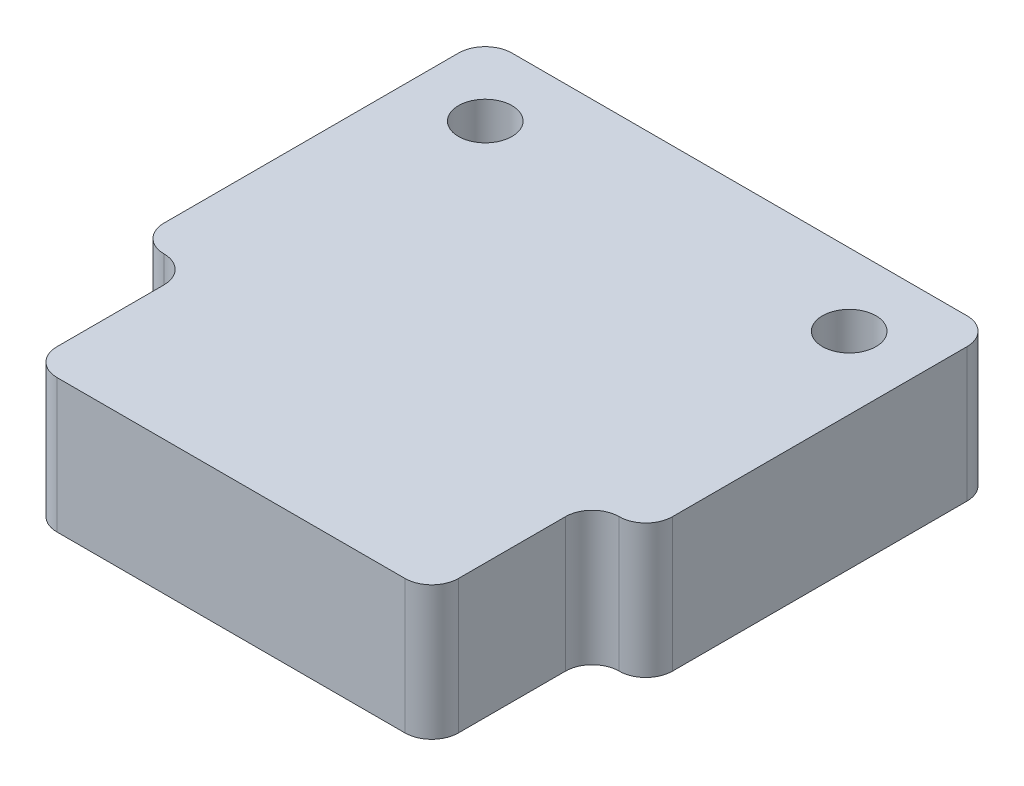
ISO-10303-21;
HEADER;
FILE_DESCRIPTION(('STEP AP214'),'2;1');
FILE_NAME('part.step','',(''),(''),'','','');
FILE_SCHEMA(('AUTOMOTIVE_DESIGN { 1 0 10303 214 1 1 1 1 }'));
ENDSEC;
DATA;
#1=APPLICATION_CONTEXT('core data for automotive mechanical design processes');
#2=APPLICATION_PROTOCOL_DEFINITION('international standard','automotive_design',2000,#1);
#3=PRODUCT_CONTEXT('',#1,'mechanical');
#4=PRODUCT('Part','Part','',(#3));
#5=PRODUCT_RELATED_PRODUCT_CATEGORY('part','',(#4));
#6=PRODUCT_DEFINITION_FORMATION('','',#4);
#7=PRODUCT_DEFINITION_CONTEXT('part definition',#1,'design');
#8=PRODUCT_DEFINITION('design','',#6,#7);
#9=PRODUCT_DEFINITION_SHAPE('','',#8);
#10=(LENGTH_UNIT() NAMED_UNIT(*) SI_UNIT(.MILLI.,.METRE.));
#11=(NAMED_UNIT(*) PLANE_ANGLE_UNIT() SI_UNIT($,.RADIAN.));
#12=(NAMED_UNIT(*) SI_UNIT($,.STERADIAN.) SOLID_ANGLE_UNIT());
#13=UNCERTAINTY_MEASURE_WITH_UNIT(LENGTH_MEASURE(1.E-05),#10,'distance_accuracy_value','');
#14=(GEOMETRIC_REPRESENTATION_CONTEXT(3) GLOBAL_UNCERTAINTY_ASSIGNED_CONTEXT((#13)) GLOBAL_UNIT_ASSIGNED_CONTEXT((#10,
#11,#12)) REPRESENTATION_CONTEXT('',''));
#15=CARTESIAN_POINT('',(0.,0.,0.));
#16=DIRECTION('',(0.,0.,1.));
#17=DIRECTION('',(1.,0.,0.));
#18=AXIS2_PLACEMENT_3D('',#15,#16,#17);
#19=CARTESIAN_POINT('',(0.,5.,0.));
#20=DIRECTION('',(0.,-1.,0.));
#21=DIRECTION('',(0.,0.,-1.));
#22=AXIS2_PLACEMENT_3D('',#19,#20,#21);
#23=PLANE('',#22);
#24=DIRECTION('',(0.,0.,-1.));
#25=VECTOR('',#24,1.);
#26=CARTESIAN_POINT('',(9.49999999999999,5.,3.5));
#27=LINE('',#26,#25);
#28=CARTESIAN_POINT('',(9.49999999999999,5.,2.49999999999999));
#29=VERTEX_POINT('',#28);
#30=CARTESIAN_POINT('',(9.49999999999999,5.,-8.50000000000001));
#31=VERTEX_POINT('',#30);
#32=EDGE_CURVE('E252',#29,#31,#27,.T.);
#33=ORIENTED_EDGE('',*,*,#32,.T.);
#34=CARTESIAN_POINT('',(8.49999999999999,5.,-8.50000000000001));
#35=DIRECTION('',(0.,-1.,0.));
#36=DIRECTION('',(0.,0.,-1.));
#37=AXIS2_PLACEMENT_3D('',#34,#35,#36);
#38=CIRCLE('',#37,1.);
#39=CARTESIAN_POINT('',(8.49999999999999,5.,-9.50000000000001));
#40=VERTEX_POINT('',#39);
#41=EDGE_CURVE('E202',#31,#40,#38,.F.);
#42=ORIENTED_EDGE('',*,*,#41,.T.);
#43=DIRECTION('',(-1.,0.,0.));
#44=VECTOR('',#43,1.);
#45=CARTESIAN_POINT('',(-9.5,5.,-9.5));
#46=LINE('',#45,#44);
#47=CARTESIAN_POINT('',(-8.5,5.,-9.5));
#48=VERTEX_POINT('',#47);
#49=EDGE_CURVE('E164',#40,#48,#46,.T.);
#50=ORIENTED_EDGE('',*,*,#49,.T.);
#51=CARTESIAN_POINT('',(-8.5,5.,-8.5));
#52=DIRECTION('',(0.,-1.,0.));
#53=DIRECTION('',(0.,0.,-1.));
#54=AXIS2_PLACEMENT_3D('',#51,#52,#53);
#55=CIRCLE('',#54,1.);
#56=CARTESIAN_POINT('',(-9.5,5.,-8.5));
#57=VERTEX_POINT('',#56);
#58=EDGE_CURVE('E65',#48,#57,#55,.F.);
#59=ORIENTED_EDGE('',*,*,#58,.T.);
#60=DIRECTION('',(0.,0.,1.));
#61=VECTOR('',#60,1.);
#62=CARTESIAN_POINT('',(-9.5,5.,3.5));
#63=LINE('',#62,#61);
#64=CARTESIAN_POINT('',(-9.5,5.,2.5));
#65=VERTEX_POINT('',#64);
#66=EDGE_CURVE('E180',#57,#65,#63,.T.);
#67=ORIENTED_EDGE('',*,*,#66,.T.);
#68=CARTESIAN_POINT('',(-8.5,5.,2.5));
#69=DIRECTION('',(0.,-1.,0.));
#70=DIRECTION('',(0.,0.,-1.));
#71=AXIS2_PLACEMENT_3D('',#68,#69,#70);
#72=CIRCLE('',#71,1.);
#73=CARTESIAN_POINT('',(-8.5,5.,3.5));
#74=VERTEX_POINT('',#73);
#75=EDGE_CURVE('E194',#65,#74,#72,.F.);
#76=ORIENTED_EDGE('',*,*,#75,.T.);
#77=CARTESIAN_POINT('',(-8.5,5.,4.5));
#78=DIRECTION('',(0.,-1.,0.));
#79=DIRECTION('',(0.,0.,-1.));
#80=AXIS2_PLACEMENT_3D('',#77,#78,#79);
#81=CIRCLE('',#80,1.);
#82=CARTESIAN_POINT('',(-7.5,5.,4.5));
#83=VERTEX_POINT('',#82);
#84=EDGE_CURVE('E11',#74,#83,#81,.T.);
#85=ORIENTED_EDGE('',*,*,#84,.T.);
#86=DIRECTION('',(0.,0.,1.));
#87=VECTOR('',#86,1.);
#88=CARTESIAN_POINT('',(-7.5,5.,9.5));
#89=LINE('',#88,#87);
#90=CARTESIAN_POINT('',(-7.5,5.,8.5));
#91=VERTEX_POINT('',#90);
#92=EDGE_CURVE('E174',#83,#91,#89,.T.);
#93=ORIENTED_EDGE('',*,*,#92,.T.);
#94=CARTESIAN_POINT('',(-6.5,5.,8.5));
#95=DIRECTION('',(0.,-1.,0.));
#96=DIRECTION('',(0.,0.,-1.));
#97=AXIS2_PLACEMENT_3D('',#94,#95,#96);
#98=CIRCLE('',#97,1.);
#99=CARTESIAN_POINT('',(-6.5,5.,9.5));
#100=VERTEX_POINT('',#99);
#101=EDGE_CURVE('E196',#91,#100,#98,.F.);
#102=ORIENTED_EDGE('',*,*,#101,.T.);
#103=DIRECTION('',(1.,0.,0.));
#104=VECTOR('',#103,1.);
#105=CARTESIAN_POINT('',(7.5,5.,9.5));
#106=LINE('',#105,#104);
#107=CARTESIAN_POINT('',(6.5,5.,9.5));
#108=VERTEX_POINT('',#107);
#109=EDGE_CURVE('E280',#100,#108,#106,.T.);
#110=ORIENTED_EDGE('',*,*,#109,.T.);
#111=CARTESIAN_POINT('',(6.5,5.,8.5));
#112=DIRECTION('',(0.,-1.,0.));
#113=DIRECTION('',(0.,0.,-1.));
#114=AXIS2_PLACEMENT_3D('',#111,#112,#113);
#115=CIRCLE('',#114,1.);
#116=CARTESIAN_POINT('',(7.5,5.,8.5));
#117=VERTEX_POINT('',#116);
#118=EDGE_CURVE('E198',#108,#117,#115,.F.);
#119=ORIENTED_EDGE('',*,*,#118,.T.);
#120=DIRECTION('',(0.,0.,-1.));
#121=VECTOR('',#120,1.);
#122=CARTESIAN_POINT('',(7.5,5.,9.5));
#123=LINE('',#122,#121);
#124=CARTESIAN_POINT('',(7.5,5.,4.5));
#125=VERTEX_POINT('',#124);
#126=EDGE_CURVE('E255',#117,#125,#123,.T.);
#127=ORIENTED_EDGE('',*,*,#126,.T.);
#128=CARTESIAN_POINT('',(8.5,5.,4.5));
#129=DIRECTION('',(0.,-1.,0.));
#130=DIRECTION('',(0.,0.,-1.));
#131=AXIS2_PLACEMENT_3D('',#128,#129,#130);
#132=CIRCLE('',#131,1.);
#133=CARTESIAN_POINT('',(8.49999999999999,5.,3.5));
#134=VERTEX_POINT('',#133);
#135=EDGE_CURVE('E225',#125,#134,#132,.T.);
#136=ORIENTED_EDGE('',*,*,#135,.T.);
#137=CARTESIAN_POINT('',(8.49999999999999,5.,2.5));
#138=DIRECTION('',(0.,-1.,0.));
#139=DIRECTION('',(0.,0.,-1.));
#140=AXIS2_PLACEMENT_3D('',#137,#138,#139);
#141=CIRCLE('',#140,1.);
#142=EDGE_CURVE('E200',#134,#29,#141,.F.);
#143=ORIENTED_EDGE('',*,*,#142,.T.);
#144=EDGE_LOOP('',(#33,#42,#50,#59,#67,#76,#85,#93,#102,#110,#119,#127,#136,#143));
#145=FACE_BOUND('',#144,.T.);
#146=CARTESIAN_POINT('',(-6.8,5.,-6.8));
#147=DIRECTION('',(0.,1.,0.));
#148=DIRECTION('',(0.,0.,1.));
#149=AXIS2_PLACEMENT_3D('',#146,#147,#148);
#150=CIRCLE('',#149,1.);
#151=CARTESIAN_POINT('',(-6.8,5.,-5.8));
#152=VERTEX_POINT('',#151);
#153=EDGE_CURVE('E263',#152,#152,#150,.T.);
#154=ORIENTED_EDGE('',*,*,#153,.F.);
#155=EDGE_LOOP('',(#154));
#156=FACE_BOUND('',#155,.T.);
#157=CARTESIAN_POINT('',(6.79999999999999,5.,-6.8));
#158=DIRECTION('',(0.,1.,0.));
#159=DIRECTION('',(0.,0.,-1.));
#160=AXIS2_PLACEMENT_3D('',#157,#158,#159);
#161=CIRCLE('',#160,1.);
#162=CARTESIAN_POINT('',(6.79999999999999,5.,-7.8));
#163=VERTEX_POINT('',#162);
#164=EDGE_CURVE('E234',#163,#163,#161,.T.);
#165=ORIENTED_EDGE('',*,*,#164,.F.);
#166=EDGE_LOOP('',(#165));
#167=FACE_BOUND('',#166,.T.);
#168=ADVANCED_FACE('F41',(#145,#156,#167),#23,.F.);
#169=CARTESIAN_POINT('',(0.,0.,0.));
#170=DIRECTION('',(0.,-1.,0.));
#171=DIRECTION('',(0.,0.,-1.));
#172=AXIS2_PLACEMENT_3D('',#169,#170,#171);
#173=PLANE('',#172);
#174=CARTESIAN_POINT('',(-6.8,0.,-6.8));
#175=DIRECTION('',(0.,1.,0.));
#176=DIRECTION('',(0.,0.,1.));
#177=AXIS2_PLACEMENT_3D('',#174,#175,#176);
#178=CIRCLE('',#177,1.);
#179=CARTESIAN_POINT('',(-6.8,0.,-5.8));
#180=VERTEX_POINT('',#179);
#181=EDGE_CURVE('E285',#180,#180,#178,.T.);
#182=ORIENTED_EDGE('',*,*,#181,.T.);
#183=EDGE_LOOP('',(#182));
#184=FACE_BOUND('',#183,.T.);
#185=DIRECTION('',(-1.,0.,0.));
#186=VECTOR('',#185,1.);
#187=CARTESIAN_POINT('',(-9.5,0.,-9.5));
#188=LINE('',#187,#186);
#189=CARTESIAN_POINT('',(8.49999999999999,0.,-9.50000000000001));
#190=VERTEX_POINT('',#189);
#191=CARTESIAN_POINT('',(-8.5,0.,-9.5));
#192=VERTEX_POINT('',#191);
#193=EDGE_CURVE('E162',#190,#192,#188,.T.);
#194=ORIENTED_EDGE('',*,*,#193,.F.);
#195=CARTESIAN_POINT('',(8.49999999999999,0.,-8.50000000000001));
#196=DIRECTION('',(0.,-1.,0.));
#197=DIRECTION('',(0.,0.,-1.));
#198=AXIS2_PLACEMENT_3D('',#195,#196,#197);
#199=CIRCLE('',#198,1.);
#200=CARTESIAN_POINT('',(9.49999999999999,0.,-8.50000000000001));
#201=VERTEX_POINT('',#200);
#202=EDGE_CURVE('E145',#190,#201,#199,.T.);
#203=ORIENTED_EDGE('',*,*,#202,.T.);
#204=DIRECTION('',(0.,0.,-1.));
#205=VECTOR('',#204,1.);
#206=CARTESIAN_POINT('',(9.49999999999999,0.,3.5));
#207=LINE('',#206,#205);
#208=CARTESIAN_POINT('',(9.49999999999999,0.,2.49999999999999));
#209=VERTEX_POINT('',#208);
#210=EDGE_CURVE('E172',#209,#201,#207,.T.);
#211=ORIENTED_EDGE('',*,*,#210,.F.);
#212=CARTESIAN_POINT('',(8.49999999999999,0.,2.5));
#213=DIRECTION('',(0.,-1.,0.));
#214=DIRECTION('',(0.,0.,-1.));
#215=AXIS2_PLACEMENT_3D('',#212,#213,#214);
#216=CIRCLE('',#215,1.);
#217=CARTESIAN_POINT('',(8.49999999999999,0.,3.5));
#218=VERTEX_POINT('',#217);
#219=EDGE_CURVE('E156',#209,#218,#216,.T.);
#220=ORIENTED_EDGE('',*,*,#219,.T.);
#221=CARTESIAN_POINT('',(8.5,0.,4.5));
#222=DIRECTION('',(0.,-1.,0.));
#223=DIRECTION('',(0.,0.,-1.));
#224=AXIS2_PLACEMENT_3D('',#221,#222,#223);
#225=CIRCLE('',#224,1.);
#226=CARTESIAN_POINT('',(7.5,0.,4.5));
#227=VERTEX_POINT('',#226);
#228=EDGE_CURVE('E223',#218,#227,#225,.F.);
#229=ORIENTED_EDGE('',*,*,#228,.T.);
#230=DIRECTION('',(0.,0.,-1.));
#231=VECTOR('',#230,1.);
#232=CARTESIAN_POINT('',(7.5,0.,9.5));
#233=LINE('',#232,#231);
#234=CARTESIAN_POINT('',(7.5,0.,8.5));
#235=VERTEX_POINT('',#234);
#236=EDGE_CURVE('E176',#235,#227,#233,.T.);
#237=ORIENTED_EDGE('',*,*,#236,.F.);
#238=CARTESIAN_POINT('',(6.5,0.,8.5));
#239=DIRECTION('',(0.,-1.,0.));
#240=DIRECTION('',(0.,0.,-1.));
#241=AXIS2_PLACEMENT_3D('',#238,#239,#240);
#242=CIRCLE('',#241,1.);
#243=CARTESIAN_POINT('',(6.5,0.,9.5));
#244=VERTEX_POINT('',#243);
#245=EDGE_CURVE('E187',#235,#244,#242,.T.);
#246=ORIENTED_EDGE('',*,*,#245,.T.);
#247=DIRECTION('',(1.,0.,0.));
#248=VECTOR('',#247,1.);
#249=CARTESIAN_POINT('',(7.5,0.,9.5));
#250=LINE('',#249,#248);
#251=CARTESIAN_POINT('',(-6.5,0.,9.5));
#252=VERTEX_POINT('',#251);
#253=EDGE_CURVE('E262',#252,#244,#250,.T.);
#254=ORIENTED_EDGE('',*,*,#253,.F.);
#255=CARTESIAN_POINT('',(-6.5,0.,8.5));
#256=DIRECTION('',(0.,-1.,0.));
#257=DIRECTION('',(0.,0.,-1.));
#258=AXIS2_PLACEMENT_3D('',#255,#256,#257);
#259=CIRCLE('',#258,1.);
#260=CARTESIAN_POINT('',(-7.5,0.,8.5));
#261=VERTEX_POINT('',#260);
#262=EDGE_CURVE('E185',#252,#261,#259,.T.);
#263=ORIENTED_EDGE('',*,*,#262,.T.);
#264=DIRECTION('',(0.,0.,1.));
#265=VECTOR('',#264,1.);
#266=CARTESIAN_POINT('',(-7.5,0.,9.5));
#267=LINE('',#266,#265);
#268=CARTESIAN_POINT('',(-7.5,0.,4.5));
#269=VERTEX_POINT('',#268);
#270=EDGE_CURVE('E259',#269,#261,#267,.T.);
#271=ORIENTED_EDGE('',*,*,#270,.F.);
#272=CARTESIAN_POINT('',(-8.5,0.,4.5));
#273=DIRECTION('',(0.,-1.,0.));
#274=DIRECTION('',(0.,0.,-1.));
#275=AXIS2_PLACEMENT_3D('',#272,#273,#274);
#276=CIRCLE('',#275,1.);
#277=CARTESIAN_POINT('',(-8.5,0.,3.5));
#278=VERTEX_POINT('',#277);
#279=EDGE_CURVE('E50',#269,#278,#276,.F.);
#280=ORIENTED_EDGE('',*,*,#279,.T.);
#281=CARTESIAN_POINT('',(-8.5,0.,2.5));
#282=DIRECTION('',(0.,-1.,0.));
#283=DIRECTION('',(0.,0.,-1.));
#284=AXIS2_PLACEMENT_3D('',#281,#282,#283);
#285=CIRCLE('',#284,1.);
#286=CARTESIAN_POINT('',(-9.5,0.,2.5));
#287=VERTEX_POINT('',#286);
#288=EDGE_CURVE('E183',#278,#287,#285,.T.);
#289=ORIENTED_EDGE('',*,*,#288,.T.);
#290=DIRECTION('',(0.,0.,1.));
#291=VECTOR('',#290,1.);
#292=CARTESIAN_POINT('',(-9.5,0.,3.5));
#293=LINE('',#292,#291);
#294=CARTESIAN_POINT('',(-9.5,0.,-8.5));
#295=VERTEX_POINT('',#294);
#296=EDGE_CURVE('E171',#295,#287,#293,.T.);
#297=ORIENTED_EDGE('',*,*,#296,.F.);
#298=CARTESIAN_POINT('',(-8.5,0.,-8.5));
#299=DIRECTION('',(0.,-1.,0.));
#300=DIRECTION('',(0.,0.,-1.));
#301=AXIS2_PLACEMENT_3D('',#298,#299,#300);
#302=CIRCLE('',#301,1.);
#303=EDGE_CURVE('E165',#295,#192,#302,.T.);
#304=ORIENTED_EDGE('',*,*,#303,.T.);
#305=EDGE_LOOP('',(#194,#203,#211,#220,#229,#237,#246,#254,#263,#271,#280,#289,#297,#304));
#306=FACE_BOUND('',#305,.T.);
#307=CARTESIAN_POINT('',(6.79999999999999,0.,-6.8));
#308=DIRECTION('',(0.,1.,0.));
#309=DIRECTION('',(0.,0.,-1.));
#310=AXIS2_PLACEMENT_3D('',#307,#308,#309);
#311=CIRCLE('',#310,1.);
#312=CARTESIAN_POINT('',(6.79999999999999,0.,-7.8));
#313=VERTEX_POINT('',#312);
#314=EDGE_CURVE('E229',#313,#313,#311,.T.);
#315=ORIENTED_EDGE('',*,*,#314,.T.);
#316=EDGE_LOOP('',(#315));
#317=FACE_BOUND('',#316,.T.);
#318=ADVANCED_FACE('F168',(#184,#306,#317),#173,.T.);
#319=CARTESIAN_POINT('',(-7.5,5.,9.5));
#320=DIRECTION('',(1.,0.,0.));
#321=DIRECTION('',(0.,0.,-1.));
#322=AXIS2_PLACEMENT_3D('',#319,#320,#321);
#323=PLANE('',#322);
#324=ORIENTED_EDGE('',*,*,#270,.T.);
#325=DIRECTION('',(0.,-1.,0.));
#326=VECTOR('',#325,1.);
#327=CARTESIAN_POINT('',(-7.5,5.,8.5));
#328=LINE('',#327,#326);
#329=EDGE_CURVE('E217',#261,#91,#328,.F.);
#330=ORIENTED_EDGE('',*,*,#329,.T.);
#331=ORIENTED_EDGE('',*,*,#92,.F.);
#332=DIRECTION('',(0.,-1.,0.));
#333=VECTOR('',#332,1.);
#334=CARTESIAN_POINT('',(-7.5,0.,4.5));
#335=LINE('',#334,#333);
#336=EDGE_CURVE('E214',#83,#269,#335,.T.);
#337=ORIENTED_EDGE('',*,*,#336,.T.);
#338=EDGE_LOOP('',(#324,#330,#331,#337));
#339=FACE_BOUND('',#338,.T.);
#340=ADVANCED_FACE('F302',(#339),#323,.F.);
#341=CARTESIAN_POINT('',(7.5,5.,9.5));
#342=DIRECTION('',(0.,0.,-1.));
#343=DIRECTION('',(-1.,0.,0.));
#344=AXIS2_PLACEMENT_3D('',#341,#342,#343);
#345=PLANE('',#344);
#346=ORIENTED_EDGE('',*,*,#253,.T.);
#347=DIRECTION('',(0.,-1.,0.));
#348=VECTOR('',#347,1.);
#349=CARTESIAN_POINT('',(6.5,5.,9.5));
#350=LINE('',#349,#348);
#351=EDGE_CURVE('E212',#244,#108,#350,.F.);
#352=ORIENTED_EDGE('',*,*,#351,.T.);
#353=ORIENTED_EDGE('',*,*,#109,.F.);
#354=DIRECTION('',(0.,-1.,0.));
#355=VECTOR('',#354,1.);
#356=CARTESIAN_POINT('',(-6.5,5.,9.5));
#357=LINE('',#356,#355);
#358=EDGE_CURVE('E209',#100,#252,#357,.T.);
#359=ORIENTED_EDGE('',*,*,#358,.T.);
#360=EDGE_LOOP('',(#346,#352,#353,#359));
#361=FACE_BOUND('',#360,.T.);
#362=ADVANCED_FACE('F319',(#361),#345,.F.);
#363=CARTESIAN_POINT('',(7.5,5.,9.5));
#364=DIRECTION('',(-1.,0.,0.));
#365=DIRECTION('',(0.,0.,1.));
#366=AXIS2_PLACEMENT_3D('',#363,#364,#365);
#367=PLANE('',#366);
#368=ORIENTED_EDGE('',*,*,#236,.T.);
#369=DIRECTION('',(0.,-1.,0.));
#370=VECTOR('',#369,1.);
#371=CARTESIAN_POINT('',(7.5,5.,4.5));
#372=LINE('',#371,#370);
#373=EDGE_CURVE('E207',#227,#125,#372,.F.);
#374=ORIENTED_EDGE('',*,*,#373,.T.);
#375=ORIENTED_EDGE('',*,*,#126,.F.);
#376=DIRECTION('',(0.,-1.,0.));
#377=VECTOR('',#376,1.);
#378=CARTESIAN_POINT('',(7.5,5.,8.5));
#379=LINE('',#378,#377);
#380=EDGE_CURVE('E204',#117,#235,#379,.T.);
#381=ORIENTED_EDGE('',*,*,#380,.T.);
#382=EDGE_LOOP('',(#368,#374,#375,#381));
#383=FACE_BOUND('',#382,.T.);
#384=ADVANCED_FACE('F269',(#383),#367,.F.);
#385=CARTESIAN_POINT('',(9.49999999999999,5.,3.5));
#386=DIRECTION('',(-1.,0.,0.));
#387=DIRECTION('',(0.,0.,1.));
#388=AXIS2_PLACEMENT_3D('',#385,#386,#387);
#389=PLANE('',#388);
#390=ORIENTED_EDGE('',*,*,#210,.T.);
#391=DIRECTION('',(0.,-1.,0.));
#392=VECTOR('',#391,1.);
#393=CARTESIAN_POINT('',(9.49999999999999,5.,-8.50000000000001));
#394=LINE('',#393,#392);
#395=EDGE_CURVE('E150',#201,#31,#394,.F.);
#396=ORIENTED_EDGE('',*,*,#395,.T.);
#397=ORIENTED_EDGE('',*,*,#32,.F.);
#398=DIRECTION('',(0.,-1.,0.));
#399=VECTOR('',#398,1.);
#400=CARTESIAN_POINT('',(9.49999999999999,5.,2.49999999999999));
#401=LINE('',#400,#399);
#402=EDGE_CURVE('E155',#29,#209,#401,.T.);
#403=ORIENTED_EDGE('',*,*,#402,.T.);
#404=EDGE_LOOP('',(#390,#396,#397,#403));
#405=FACE_BOUND('',#404,.T.);
#406=ADVANCED_FACE('F313',(#405),#389,.F.);
#407=CARTESIAN_POINT('',(-9.5,5.,-9.5));
#408=DIRECTION('',(0.,0.,1.));
#409=DIRECTION('',(1.,0.,0.));
#410=AXIS2_PLACEMENT_3D('',#407,#408,#409);
#411=PLANE('',#410);
#412=ORIENTED_EDGE('',*,*,#49,.F.);
#413=DIRECTION('',(0.,-1.,0.));
#414=VECTOR('',#413,1.);
#415=CARTESIAN_POINT('',(8.49999999999999,5.,-9.50000000000001));
#416=LINE('',#415,#414);
#417=EDGE_CURVE('E149',#40,#190,#416,.T.);
#418=ORIENTED_EDGE('',*,*,#417,.T.);
#419=ORIENTED_EDGE('',*,*,#193,.T.);
#420=DIRECTION('',(0.,-1.,0.));
#421=VECTOR('',#420,1.);
#422=CARTESIAN_POINT('',(-8.5,5.,-9.5));
#423=LINE('',#422,#421);
#424=EDGE_CURVE('E166',#192,#48,#423,.F.);
#425=ORIENTED_EDGE('',*,*,#424,.T.);
#426=EDGE_LOOP('',(#412,#418,#419,#425));
#427=FACE_BOUND('',#426,.T.);
#428=ADVANCED_FACE('F161',(#427),#411,.F.);
#429=CARTESIAN_POINT('',(-9.5,5.,3.5));
#430=DIRECTION('',(1.,0.,0.));
#431=DIRECTION('',(0.,0.,-1.));
#432=AXIS2_PLACEMENT_3D('',#429,#430,#431);
#433=PLANE('',#432);
#434=ORIENTED_EDGE('',*,*,#296,.T.);
#435=DIRECTION('',(0.,-1.,0.));
#436=VECTOR('',#435,1.);
#437=CARTESIAN_POINT('',(-9.5,5.,2.5));
#438=LINE('',#437,#436);
#439=EDGE_CURVE('E58',#287,#65,#438,.F.);
#440=ORIENTED_EDGE('',*,*,#439,.T.);
#441=ORIENTED_EDGE('',*,*,#66,.F.);
#442=DIRECTION('',(0.,-1.,0.));
#443=VECTOR('',#442,1.);
#444=CARTESIAN_POINT('',(-9.5,5.,-8.5));
#445=LINE('',#444,#443);
#446=EDGE_CURVE('E219',#57,#295,#445,.T.);
#447=ORIENTED_EDGE('',*,*,#446,.T.);
#448=EDGE_LOOP('',(#434,#440,#441,#447));
#449=FACE_BOUND('',#448,.T.);
#450=ADVANCED_FACE('F247',(#449),#433,.F.);
#451=CARTESIAN_POINT('',(-6.8,5.,-6.8));
#452=DIRECTION('',(0.,-1.,0.));
#453=DIRECTION('',(0.,0.,-1.));
#454=AXIS2_PLACEMENT_3D('',#451,#452,#453);
#455=CYLINDRICAL_SURFACE('',#454,1.);
#456=ORIENTED_EDGE('',*,*,#153,.T.);
#457=EDGE_LOOP('',(#456));
#458=FACE_BOUND('',#457,.T.);
#459=ORIENTED_EDGE('',*,*,#181,.F.);
#460=EDGE_LOOP('',(#459));
#461=FACE_BOUND('',#460,.T.);
#462=ADVANCED_FACE('F306',(#458,#461),#455,.F.);
#463=CARTESIAN_POINT('',(6.79999999999999,5.,-6.8));
#464=DIRECTION('',(0.,-1.,0.));
#465=DIRECTION('',(0.,0.,-1.));
#466=AXIS2_PLACEMENT_3D('',#463,#464,#465);
#467=CYLINDRICAL_SURFACE('',#466,1.);
#468=ORIENTED_EDGE('',*,*,#164,.T.);
#469=EDGE_LOOP('',(#468));
#470=FACE_BOUND('',#469,.T.);
#471=ORIENTED_EDGE('',*,*,#314,.F.);
#472=EDGE_LOOP('',(#471));
#473=FACE_BOUND('',#472,.T.);
#474=ADVANCED_FACE('F293',(#470,#473),#467,.F.);
#475=CARTESIAN_POINT('',(8.49999999999999,5.,-8.50000000000001));
#476=DIRECTION('',(0.,-1.,0.));
#477=DIRECTION('',(0.,0.,-1.));
#478=AXIS2_PLACEMENT_3D('',#475,#476,#477);
#479=CYLINDRICAL_SURFACE('',#478,1.);
#480=ORIENTED_EDGE('',*,*,#41,.F.);
#481=ORIENTED_EDGE('',*,*,#395,.F.);
#482=ORIENTED_EDGE('',*,*,#202,.F.);
#483=ORIENTED_EDGE('',*,*,#417,.F.);
#484=EDGE_LOOP('',(#480,#481,#482,#483));
#485=FACE_BOUND('',#484,.T.);
#486=ADVANCED_FACE('F148',(#485),#479,.T.);
#487=CARTESIAN_POINT('',(8.5,5.,4.5));
#488=DIRECTION('',(0.,1.,0.));
#489=DIRECTION('',(0.,0.,1.));
#490=AXIS2_PLACEMENT_3D('',#487,#488,#489);
#491=CYLINDRICAL_SURFACE('',#490,1.);
#492=DIRECTION('',(0.,-1.,0.));
#493=VECTOR('',#492,1.);
#494=CARTESIAN_POINT('',(8.5,0.,3.5));
#495=LINE('',#494,#493);
#496=EDGE_CURVE('E227',#134,#218,#495,.T.);
#497=ORIENTED_EDGE('',*,*,#496,.F.);
#498=ORIENTED_EDGE('',*,*,#135,.F.);
#499=ORIENTED_EDGE('',*,*,#373,.F.);
#500=ORIENTED_EDGE('',*,*,#228,.F.);
#501=EDGE_LOOP('',(#497,#498,#499,#500));
#502=FACE_BOUND('',#501,.T.);
#503=ADVANCED_FACE('F276',(#502),#491,.F.);
#504=CARTESIAN_POINT('',(8.49999999999999,5.,2.5));
#505=DIRECTION('',(0.,-1.,0.));
#506=DIRECTION('',(0.,0.,-1.));
#507=AXIS2_PLACEMENT_3D('',#504,#505,#506);
#508=CYLINDRICAL_SURFACE('',#507,1.);
#509=ORIENTED_EDGE('',*,*,#142,.F.);
#510=ORIENTED_EDGE('',*,*,#496,.T.);
#511=ORIENTED_EDGE('',*,*,#219,.F.);
#512=ORIENTED_EDGE('',*,*,#402,.F.);
#513=EDGE_LOOP('',(#509,#510,#511,#512));
#514=FACE_BOUND('',#513,.T.);
#515=ADVANCED_FACE('F328',(#514),#508,.T.);
#516=CARTESIAN_POINT('',(6.5,5.,8.5));
#517=DIRECTION('',(0.,-1.,0.));
#518=DIRECTION('',(0.,0.,-1.));
#519=AXIS2_PLACEMENT_3D('',#516,#517,#518);
#520=CYLINDRICAL_SURFACE('',#519,1.);
#521=ORIENTED_EDGE('',*,*,#118,.F.);
#522=ORIENTED_EDGE('',*,*,#351,.F.);
#523=ORIENTED_EDGE('',*,*,#245,.F.);
#524=ORIENTED_EDGE('',*,*,#380,.F.);
#525=EDGE_LOOP('',(#521,#522,#523,#524));
#526=FACE_BOUND('',#525,.T.);
#527=ADVANCED_FACE('F331',(#526),#520,.T.);
#528=CARTESIAN_POINT('',(-6.5,5.,8.5));
#529=DIRECTION('',(0.,-1.,0.));
#530=DIRECTION('',(0.,0.,-1.));
#531=AXIS2_PLACEMENT_3D('',#528,#529,#530);
#532=CYLINDRICAL_SURFACE('',#531,1.);
#533=ORIENTED_EDGE('',*,*,#101,.F.);
#534=ORIENTED_EDGE('',*,*,#329,.F.);
#535=ORIENTED_EDGE('',*,*,#262,.F.);
#536=ORIENTED_EDGE('',*,*,#358,.F.);
#537=EDGE_LOOP('',(#533,#534,#535,#536));
#538=FACE_BOUND('',#537,.T.);
#539=ADVANCED_FACE('F336',(#538),#532,.T.);
#540=CARTESIAN_POINT('',(-8.5,5.,2.5));
#541=DIRECTION('',(0.,-1.,0.));
#542=DIRECTION('',(0.,0.,-1.));
#543=AXIS2_PLACEMENT_3D('',#540,#541,#542);
#544=CYLINDRICAL_SURFACE('',#543,1.);
#545=DIRECTION('',(0.,-1.,0.));
#546=VECTOR('',#545,1.);
#547=CARTESIAN_POINT('',(-8.5,5.,3.5));
#548=LINE('',#547,#546);
#549=EDGE_CURVE('E45',#74,#278,#548,.T.);
#550=ORIENTED_EDGE('',*,*,#549,.F.);
#551=ORIENTED_EDGE('',*,*,#75,.F.);
#552=ORIENTED_EDGE('',*,*,#439,.F.);
#553=ORIENTED_EDGE('',*,*,#288,.F.);
#554=EDGE_LOOP('',(#550,#551,#552,#553));
#555=FACE_BOUND('',#554,.T.);
#556=ADVANCED_FACE('F245',(#555),#544,.T.);
#557=CARTESIAN_POINT('',(-8.5,5.,4.5));
#558=DIRECTION('',(0.,1.,0.));
#559=DIRECTION('',(0.,0.,1.));
#560=AXIS2_PLACEMENT_3D('',#557,#558,#559);
#561=CYLINDRICAL_SURFACE('',#560,1.);
#562=ORIENTED_EDGE('',*,*,#84,.F.);
#563=ORIENTED_EDGE('',*,*,#549,.T.);
#564=ORIENTED_EDGE('',*,*,#279,.F.);
#565=ORIENTED_EDGE('',*,*,#336,.F.);
#566=EDGE_LOOP('',(#562,#563,#564,#565));
#567=FACE_BOUND('',#566,.T.);
#568=ADVANCED_FACE('F240',(#567),#561,.F.);
#569=CARTESIAN_POINT('',(-8.5,5.,-8.5));
#570=DIRECTION('',(0.,-1.,0.));
#571=DIRECTION('',(0.,0.,-1.));
#572=AXIS2_PLACEMENT_3D('',#569,#570,#571);
#573=CYLINDRICAL_SURFACE('',#572,1.);
#574=ORIENTED_EDGE('',*,*,#58,.F.);
#575=ORIENTED_EDGE('',*,*,#424,.F.);
#576=ORIENTED_EDGE('',*,*,#303,.F.);
#577=ORIENTED_EDGE('',*,*,#446,.F.);
#578=EDGE_LOOP('',(#574,#575,#576,#577));
#579=FACE_BOUND('',#578,.T.);
#580=ADVANCED_FACE('F43',(#579),#573,.T.);
#581=CLOSED_SHELL('',(#168,#318,#340,#362,#384,#406,#428,#450,#462,#474,#486,#503,#515,#527,
#539,#556,#568,#580));
#582=MANIFOLD_SOLID_BREP('B2',#581);
#583=ADVANCED_BREP_SHAPE_REPRESENTATION('',(#18,#582),#14);
#584=SHAPE_DEFINITION_REPRESENTATION(#9,#583);
ENDSEC;
END-ISO-10303-21;
